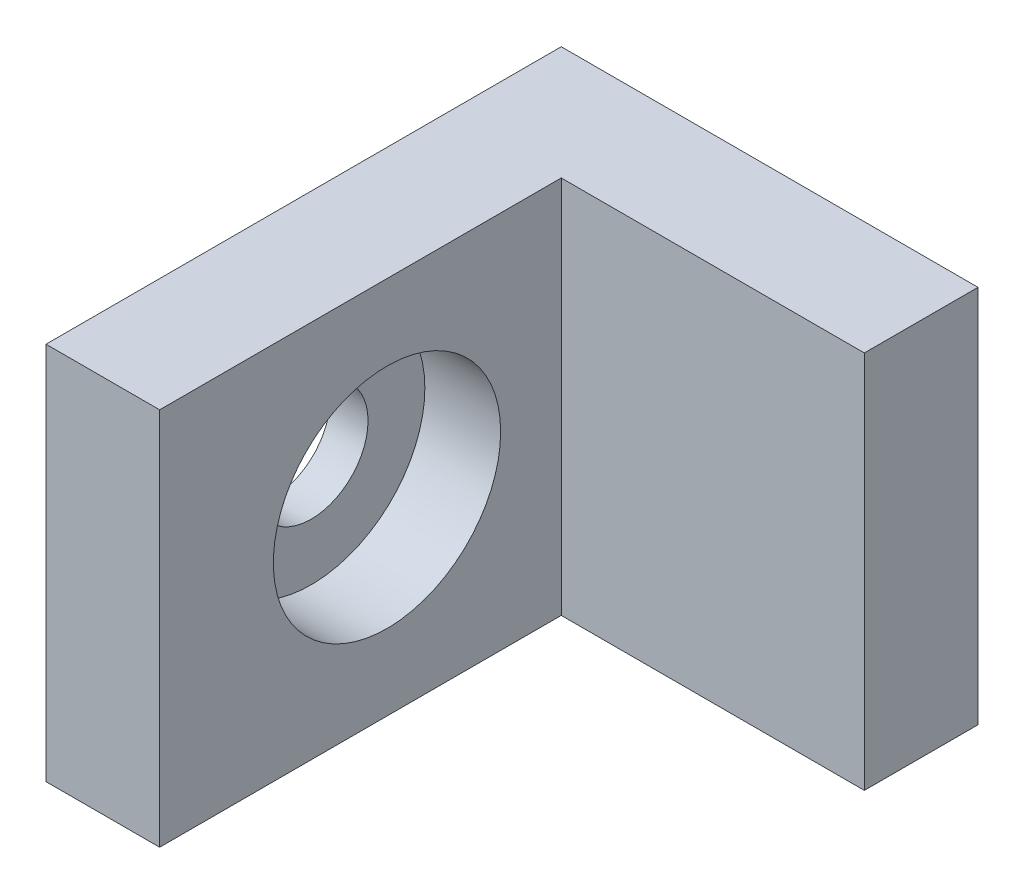
ISO-10303-21;
HEADER;
FILE_DESCRIPTION(('STEP AP214'),'2;1');
FILE_NAME('part.step','',(''),(''),'','','');
FILE_SCHEMA(('AUTOMOTIVE_DESIGN { 1 0 10303 214 1 1 1 1 }'));
ENDSEC;
DATA;
#1=APPLICATION_CONTEXT('core data for automotive mechanical design processes');
#2=APPLICATION_PROTOCOL_DEFINITION('international standard','automotive_design',2000,#1);
#3=PRODUCT_CONTEXT('',#1,'mechanical');
#4=PRODUCT('Part','Part','',(#3));
#5=PRODUCT_RELATED_PRODUCT_CATEGORY('part','',(#4));
#6=PRODUCT_DEFINITION_FORMATION('','',#4);
#7=PRODUCT_DEFINITION_CONTEXT('part definition',#1,'design');
#8=PRODUCT_DEFINITION('design','',#6,#7);
#9=PRODUCT_DEFINITION_SHAPE('','',#8);
#10=(LENGTH_UNIT() NAMED_UNIT(*) SI_UNIT(.MILLI.,.METRE.));
#11=(NAMED_UNIT(*) PLANE_ANGLE_UNIT() SI_UNIT($,.RADIAN.));
#12=(NAMED_UNIT(*) SI_UNIT($,.STERADIAN.) SOLID_ANGLE_UNIT());
#13=UNCERTAINTY_MEASURE_WITH_UNIT(LENGTH_MEASURE(1.E-05),#10,'distance_accuracy_value','');
#14=(GEOMETRIC_REPRESENTATION_CONTEXT(3) GLOBAL_UNCERTAINTY_ASSIGNED_CONTEXT((#13)) GLOBAL_UNIT_ASSIGNED_CONTEXT((#10,
#11,#12)) REPRESENTATION_CONTEXT('',''));
#15=CARTESIAN_POINT('',(0.,0.,0.));
#16=DIRECTION('',(0.,0.,1.));
#17=DIRECTION('',(1.,0.,0.));
#18=AXIS2_PLACEMENT_3D('',#15,#16,#17);
#19=CARTESIAN_POINT('',(3.,10.,0.));
#20=DIRECTION('',(0.,-1.,0.));
#21=DIRECTION('',(0.,0.,-1.));
#22=AXIS2_PLACEMENT_3D('',#19,#20,#21);
#23=PLANE('',#22);
#24=DIRECTION('',(1.,0.,0.));
#25=VECTOR('',#24,1.);
#26=CARTESIAN_POINT('',(0.,10.,2.4));
#27=LINE('',#26,#25);
#28=CARTESIAN_POINT('',(0.,10.,2.4));
#29=VERTEX_POINT('',#28);
#30=CARTESIAN_POINT('',(11.,10.,2.4));
#31=VERTEX_POINT('',#30);
#32=EDGE_CURVE('E50',#29,#31,#27,.T.);
#33=ORIENTED_EDGE('',*,*,#32,.F.);
#34=DIRECTION('',(0.,0.,1.));
#35=VECTOR('',#34,1.);
#36=CARTESIAN_POINT('',(0.,10.,0.));
#37=LINE('',#36,#35);
#38=CARTESIAN_POINT('',(0.,10.,16.));
#39=VERTEX_POINT('',#38);
#40=EDGE_CURVE('E83',#29,#39,#37,.T.);
#41=ORIENTED_EDGE('',*,*,#40,.T.);
#42=DIRECTION('',(-1.,0.,0.));
#43=VECTOR('',#42,1.);
#44=CARTESIAN_POINT('',(3.,10.,16.));
#45=LINE('',#44,#43);
#46=CARTESIAN_POINT('',(3.,10.,16.));
#47=VERTEX_POINT('',#46);
#48=EDGE_CURVE('E78',#47,#39,#45,.T.);
#49=ORIENTED_EDGE('',*,*,#48,.F.);
#50=DIRECTION('',(0.,0.,1.));
#51=VECTOR('',#50,1.);
#52=CARTESIAN_POINT('',(3.,10.,0.));
#53=LINE('',#52,#51);
#54=CARTESIAN_POINT('',(3.,10.,5.4));
#55=VERTEX_POINT('',#54);
#56=EDGE_CURVE('E96',#55,#47,#53,.T.);
#57=ORIENTED_EDGE('',*,*,#56,.F.);
#58=DIRECTION('',(-1.,0.,0.));
#59=VECTOR('',#58,1.);
#60=CARTESIAN_POINT('',(11.,10.,5.4));
#61=LINE('',#60,#59);
#62=CARTESIAN_POINT('',(11.,10.,5.4));
#63=VERTEX_POINT('',#62);
#64=EDGE_CURVE('E265',#63,#55,#61,.T.);
#65=ORIENTED_EDGE('',*,*,#64,.F.);
#66=DIRECTION('',(0.,0.,1.));
#67=VECTOR('',#66,1.);
#68=CARTESIAN_POINT('',(11.,10.,0.399999999999999));
#69=LINE('',#68,#67);
#70=EDGE_CURVE('E284',#31,#63,#69,.T.);
#71=ORIENTED_EDGE('',*,*,#70,.F.);
#72=EDGE_LOOP('',(#33,#41,#49,#57,#65,#71));
#73=FACE_BOUND('',#72,.T.);
#74=ADVANCED_FACE('F35',(#73),#23,.F.);
#75=CARTESIAN_POINT('',(3.,0.,0.));
#76=DIRECTION('',(0.,1.,0.));
#77=DIRECTION('',(0.,0.,1.));
#78=AXIS2_PLACEMENT_3D('',#75,#76,#77);
#79=PLANE('',#78);
#80=DIRECTION('',(-1.,0.,0.));
#81=VECTOR('',#80,1.);
#82=CARTESIAN_POINT('',(11.,0.,2.4));
#83=LINE('',#82,#81);
#84=CARTESIAN_POINT('',(11.,0.,2.4));
#85=VERTEX_POINT('',#84);
#86=CARTESIAN_POINT('',(0.,0.,2.4));
#87=VERTEX_POINT('',#86);
#88=EDGE_CURVE('E300',#85,#87,#83,.T.);
#89=ORIENTED_EDGE('',*,*,#88,.F.);
#90=DIRECTION('',(0.,0.,-1.));
#91=VECTOR('',#90,1.);
#92=CARTESIAN_POINT('',(11.,0.,0.399999999999999));
#93=LINE('',#92,#91);
#94=CARTESIAN_POINT('',(11.,0.,5.4));
#95=VERTEX_POINT('',#94);
#96=EDGE_CURVE('E282',#95,#85,#93,.T.);
#97=ORIENTED_EDGE('',*,*,#96,.F.);
#98=DIRECTION('',(1.,0.,0.));
#99=VECTOR('',#98,1.);
#100=CARTESIAN_POINT('',(3.,0.,5.4));
#101=LINE('',#100,#99);
#102=CARTESIAN_POINT('',(3.,0.,5.4));
#103=VERTEX_POINT('',#102);
#104=EDGE_CURVE('E277',#103,#95,#101,.T.);
#105=ORIENTED_EDGE('',*,*,#104,.F.);
#106=DIRECTION('',(0.,0.,-1.));
#107=VECTOR('',#106,1.);
#108=CARTESIAN_POINT('',(3.,0.,0.));
#109=LINE('',#108,#107);
#110=CARTESIAN_POINT('',(3.,0.,16.));
#111=VERTEX_POINT('',#110);
#112=EDGE_CURVE('E91',#111,#103,#109,.T.);
#113=ORIENTED_EDGE('',*,*,#112,.F.);
#114=DIRECTION('',(-1.,0.,0.));
#115=VECTOR('',#114,1.);
#116=CARTESIAN_POINT('',(3.,0.,16.));
#117=LINE('',#116,#115);
#118=CARTESIAN_POINT('',(0.,0.,16.));
#119=VERTEX_POINT('',#118);
#120=EDGE_CURVE('E75',#111,#119,#117,.T.);
#121=ORIENTED_EDGE('',*,*,#120,.T.);
#122=DIRECTION('',(0.,0.,-1.));
#123=VECTOR('',#122,1.);
#124=CARTESIAN_POINT('',(0.,0.,0.));
#125=LINE('',#124,#123);
#126=EDGE_CURVE('E82',#119,#87,#125,.T.);
#127=ORIENTED_EDGE('',*,*,#126,.T.);
#128=EDGE_LOOP('',(#89,#97,#105,#113,#121,#127));
#129=FACE_BOUND('',#128,.T.);
#130=ADVANCED_FACE('F88',(#129),#79,.F.);
#131=CARTESIAN_POINT('',(0.,0.,0.));
#132=DIRECTION('',(1.,0.,0.));
#133=DIRECTION('',(0.,0.,-1.));
#134=AXIS2_PLACEMENT_3D('',#131,#132,#133);
#135=PLANE('',#134);
#136=CARTESIAN_POINT('',(0.,5.,10.));
#137=DIRECTION('',(1.,0.,0.));
#138=DIRECTION('',(0.,0.,-1.));
#139=AXIS2_PLACEMENT_3D('',#136,#137,#138);
#140=CIRCLE('',#139,1.5);
#141=CARTESIAN_POINT('',(0.,5.,8.5));
#142=VERTEX_POINT('',#141);
#143=EDGE_CURVE('E105',#142,#142,#140,.T.);
#144=ORIENTED_EDGE('',*,*,#143,.T.);
#145=EDGE_LOOP('',(#144));
#146=FACE_BOUND('',#145,.T.);
#147=DIRECTION('',(0.,1.,0.));
#148=VECTOR('',#147,1.);
#149=CARTESIAN_POINT('',(0.,0.,2.4));
#150=LINE('',#149,#148);
#151=EDGE_CURVE('E95',#87,#29,#150,.T.);
#152=ORIENTED_EDGE('',*,*,#151,.F.);
#153=ORIENTED_EDGE('',*,*,#126,.F.);
#154=DIRECTION('',(0.,-1.,0.));
#155=VECTOR('',#154,1.);
#156=CARTESIAN_POINT('',(0.,0.,16.));
#157=LINE('',#156,#155);
#158=EDGE_CURVE('E72',#39,#119,#157,.T.);
#159=ORIENTED_EDGE('',*,*,#158,.F.);
#160=ORIENTED_EDGE('',*,*,#40,.F.);
#161=EDGE_LOOP('',(#152,#153,#159,#160));
#162=FACE_BOUND('',#161,.T.);
#163=ADVANCED_FACE('F94',(#146,#162),#135,.F.);
#164=CARTESIAN_POINT('',(11.,0.,0.));
#165=DIRECTION('',(-1.,0.,0.));
#166=DIRECTION('',(0.,0.,1.));
#167=AXIS2_PLACEMENT_3D('',#164,#165,#166);
#168=PLANE('',#167);
#169=DIRECTION('',(0.,-1.,0.));
#170=VECTOR('',#169,1.);
#171=CARTESIAN_POINT('',(11.,10.,2.4));
#172=LINE('',#171,#170);
#173=EDGE_CURVE('E303',#31,#85,#172,.T.);
#174=ORIENTED_EDGE('',*,*,#173,.F.);
#175=ORIENTED_EDGE('',*,*,#70,.T.);
#176=DIRECTION('',(0.,1.,0.));
#177=VECTOR('',#176,1.);
#178=CARTESIAN_POINT('',(11.,0.,5.4));
#179=LINE('',#178,#177);
#180=EDGE_CURVE('E110',#95,#63,#179,.T.);
#181=ORIENTED_EDGE('',*,*,#180,.F.);
#182=ORIENTED_EDGE('',*,*,#96,.T.);
#183=EDGE_LOOP('',(#174,#175,#181,#182));
#184=FACE_BOUND('',#183,.T.);
#185=ADVANCED_FACE('F140',(#184),#168,.F.);
#186=CARTESIAN_POINT('',(0.,5.,10.));
#187=DIRECTION('',(1.,0.,0.));
#188=DIRECTION('',(0.,0.,-1.));
#189=AXIS2_PLACEMENT_3D('',#186,#187,#188);
#190=CYLINDRICAL_SURFACE('',#189,1.5);
#191=ORIENTED_EDGE('',*,*,#143,.F.);
#192=EDGE_LOOP('',(#191));
#193=FACE_BOUND('',#192,.T.);
#194=CARTESIAN_POINT('',(1.,5.,10.));
#195=DIRECTION('',(1.,0.,0.));
#196=DIRECTION('',(0.,0.,-1.));
#197=AXIS2_PLACEMENT_3D('',#194,#195,#196);
#198=CIRCLE('',#197,1.5);
#199=CARTESIAN_POINT('',(1.,5.,8.5));
#200=VERTEX_POINT('',#199);
#201=EDGE_CURVE('E102',#200,#200,#198,.F.);
#202=ORIENTED_EDGE('',*,*,#201,.F.);
#203=EDGE_LOOP('',(#202));
#204=FACE_BOUND('',#203,.T.);
#205=ADVANCED_FACE('F136',(#193,#204),#190,.F.);
#206=CARTESIAN_POINT('',(3.,0.,16.));
#207=DIRECTION('',(0.,0.,-1.));
#208=DIRECTION('',(-1.,0.,0.));
#209=AXIS2_PLACEMENT_3D('',#206,#207,#208);
#210=PLANE('',#209);
#211=ORIENTED_EDGE('',*,*,#158,.T.);
#212=ORIENTED_EDGE('',*,*,#120,.F.);
#213=DIRECTION('',(0.,-1.,0.));
#214=VECTOR('',#213,1.);
#215=CARTESIAN_POINT('',(3.,0.,16.));
#216=LINE('',#215,#214);
#217=EDGE_CURVE('E59',#47,#111,#216,.T.);
#218=ORIENTED_EDGE('',*,*,#217,.F.);
#219=ORIENTED_EDGE('',*,*,#48,.T.);
#220=EDGE_LOOP('',(#211,#212,#218,#219));
#221=FACE_BOUND('',#220,.T.);
#222=ADVANCED_FACE('F74',(#221),#210,.F.);
#223=CARTESIAN_POINT('',(3.,0.,0.));
#224=DIRECTION('',(1.,0.,0.));
#225=DIRECTION('',(0.,0.,-1.));
#226=AXIS2_PLACEMENT_3D('',#223,#224,#225);
#227=PLANE('',#226);
#228=DIRECTION('',(0.,-1.,0.));
#229=VECTOR('',#228,1.);
#230=CARTESIAN_POINT('',(3.,10.,5.4));
#231=LINE('',#230,#229);
#232=EDGE_CURVE('E269',#55,#103,#231,.T.);
#233=ORIENTED_EDGE('',*,*,#232,.F.);
#234=ORIENTED_EDGE('',*,*,#56,.T.);
#235=ORIENTED_EDGE('',*,*,#217,.T.);
#236=ORIENTED_EDGE('',*,*,#112,.T.);
#237=EDGE_LOOP('',(#233,#234,#235,#236));
#238=FACE_BOUND('',#237,.T.);
#239=CARTESIAN_POINT('',(3.,5.,10.));
#240=DIRECTION('',(1.,0.,0.));
#241=DIRECTION('',(0.,0.,-1.));
#242=AXIS2_PLACEMENT_3D('',#239,#240,#241);
#243=CIRCLE('',#242,3.);
#244=CARTESIAN_POINT('',(3.,5.,7.));
#245=VERTEX_POINT('',#244);
#246=EDGE_CURVE('E109',#245,#245,#243,.T.);
#247=ORIENTED_EDGE('',*,*,#246,.F.);
#248=EDGE_LOOP('',(#247));
#249=FACE_BOUND('',#248,.T.);
#250=ADVANCED_FACE('F135',(#238,#249),#227,.T.);
#251=CARTESIAN_POINT('',(1.,5.,10.));
#252=DIRECTION('',(1.,0.,0.));
#253=DIRECTION('',(0.,0.,-1.));
#254=AXIS2_PLACEMENT_3D('',#251,#252,#253);
#255=PLANE('',#254);
#256=CARTESIAN_POINT('',(1.,5.,10.));
#257=DIRECTION('',(1.,0.,0.));
#258=DIRECTION('',(0.,0.,-1.));
#259=AXIS2_PLACEMENT_3D('',#256,#257,#258);
#260=CIRCLE('',#259,3.);
#261=CARTESIAN_POINT('',(1.,5.,7.));
#262=VERTEX_POINT('',#261);
#263=EDGE_CURVE('E106',#262,#262,#260,.T.);
#264=ORIENTED_EDGE('',*,*,#263,.T.);
#265=EDGE_LOOP('',(#264));
#266=FACE_BOUND('',#265,.T.);
#267=ORIENTED_EDGE('',*,*,#201,.T.);
#268=EDGE_LOOP('',(#267));
#269=FACE_BOUND('',#268,.T.);
#270=ADVANCED_FACE('F144',(#266,#269),#255,.T.);
#271=CARTESIAN_POINT('',(1.,5.,10.));
#272=DIRECTION('',(1.,0.,0.));
#273=DIRECTION('',(0.,0.,-1.));
#274=AXIS2_PLACEMENT_3D('',#271,#272,#273);
#275=CYLINDRICAL_SURFACE('',#274,3.);
#276=ORIENTED_EDGE('',*,*,#263,.F.);
#277=EDGE_LOOP('',(#276));
#278=FACE_BOUND('',#277,.T.);
#279=ORIENTED_EDGE('',*,*,#246,.T.);
#280=EDGE_LOOP('',(#279));
#281=FACE_BOUND('',#280,.T.);
#282=ADVANCED_FACE('F151',(#278,#281),#275,.F.);
#283=CARTESIAN_POINT('',(0.,0.,5.4));
#284=DIRECTION('',(0.,0.,1.));
#285=DIRECTION('',(1.,0.,0.));
#286=AXIS2_PLACEMENT_3D('',#283,#284,#285);
#287=PLANE('',#286);
#288=ORIENTED_EDGE('',*,*,#64,.T.);
#289=ORIENTED_EDGE('',*,*,#232,.T.);
#290=ORIENTED_EDGE('',*,*,#104,.T.);
#291=ORIENTED_EDGE('',*,*,#180,.T.);
#292=EDGE_LOOP('',(#288,#289,#290,#291));
#293=FACE_BOUND('',#292,.T.);
#294=ADVANCED_FACE('F154',(#293),#287,.T.);
#295=CARTESIAN_POINT('',(0.,0.,2.4));
#296=DIRECTION('',(0.,0.,-1.));
#297=DIRECTION('',(0.,1.,0.));
#298=AXIS2_PLACEMENT_3D('',#295,#296,#297);
#299=PLANE('',#298);
#300=CARTESIAN_POINT('',(7.8,5.,2.4));
#301=DIRECTION('',(0.,0.,-1.));
#302=DIRECTION('',(0.,1.,0.));
#303=AXIS2_PLACEMENT_3D('',#300,#301,#302);
#304=CIRCLE('',#303,2.5);
#305=CARTESIAN_POINT('',(7.8,7.5,2.4));
#306=VERTEX_POINT('',#305);
#307=EDGE_CURVE('E43',#306,#306,#304,.F.);
#308=ORIENTED_EDGE('',*,*,#307,.T.);
#309=EDGE_LOOP('',(#308));
#310=FACE_BOUND('',#309,.T.);
#311=ORIENTED_EDGE('',*,*,#173,.T.);
#312=ORIENTED_EDGE('',*,*,#88,.T.);
#313=ORIENTED_EDGE('',*,*,#151,.T.);
#314=ORIENTED_EDGE('',*,*,#32,.T.);
#315=EDGE_LOOP('',(#311,#312,#313,#314));
#316=FACE_BOUND('',#315,.T.);
#317=ADVANCED_FACE('F114',(#310,#316),#299,.T.);
#318=CARTESIAN_POINT('',(0.,0.,3.4));
#319=DIRECTION('',(0.,0.,1.));
#320=DIRECTION('',(1.,0.,0.));
#321=AXIS2_PLACEMENT_3D('',#318,#319,#320);
#322=PLANE('',#321);
#323=CARTESIAN_POINT('',(7.8,5.,3.4));
#324=DIRECTION('',(0.,0.,-1.));
#325=DIRECTION('',(0.,1.,0.));
#326=AXIS2_PLACEMENT_3D('',#323,#324,#325);
#327=CIRCLE('',#326,2.1);
#328=CARTESIAN_POINT('',(7.8,7.1,3.4));
#329=VERTEX_POINT('',#328);
#330=EDGE_CURVE('E107',#329,#329,#327,.T.);
#331=ORIENTED_EDGE('',*,*,#330,.T.);
#332=EDGE_LOOP('',(#331));
#333=FACE_BOUND('',#332,.T.);
#334=ADVANCED_FACE('F123',(#333),#322,.F.);
#335=CARTESIAN_POINT('',(7.8,5.,4.6));
#336=DIRECTION('',(0.,0.,-1.));
#337=DIRECTION('',(0.,1.,0.));
#338=AXIS2_PLACEMENT_3D('',#335,#336,#337);
#339=CYLINDRICAL_SURFACE('',#338,2.1);
#340=CARTESIAN_POINT('',(7.8,5.,2.8));
#341=DIRECTION('',(0.,0.,-1.));
#342=DIRECTION('',(0.,1.,0.));
#343=AXIS2_PLACEMENT_3D('',#340,#341,#342);
#344=CIRCLE('',#343,2.1);
#345=CARTESIAN_POINT('',(7.8,7.1,2.8));
#346=VERTEX_POINT('',#345);
#347=EDGE_CURVE('E11',#346,#346,#344,.T.);
#348=ORIENTED_EDGE('',*,*,#347,.T.);
#349=EDGE_LOOP('',(#348));
#350=FACE_BOUND('',#349,.T.);
#351=ORIENTED_EDGE('',*,*,#330,.F.);
#352=EDGE_LOOP('',(#351));
#353=FACE_BOUND('',#352,.T.);
#354=ADVANCED_FACE('F117',(#350,#353),#339,.F.);
#355=CARTESIAN_POINT('',(7.8,5.,2.8));
#356=DIRECTION('',(0.,0.,-1.));
#357=DIRECTION('',(0.,1.,0.));
#358=AXIS2_PLACEMENT_3D('',#355,#356,#357);
#359=TOROIDAL_SURFACE('',#358,2.5,0.4);
#360=ORIENTED_EDGE('',*,*,#347,.F.);
#361=EDGE_LOOP('',(#360));
#362=FACE_BOUND('',#361,.T.);
#363=ORIENTED_EDGE('',*,*,#307,.F.);
#364=EDGE_LOOP('',(#363));
#365=FACE_BOUND('',#364,.T.);
#366=ADVANCED_FACE('F37',(#362,#365),#359,.T.);
#367=CLOSED_SHELL('',(#74,#130,#163,#185,#205,#222,#250,#270,#282,#294,#317,#334,#354,#366));
#368=MANIFOLD_SOLID_BREP('B2',#367);
#369=ADVANCED_BREP_SHAPE_REPRESENTATION('',(#18,#368),#14);
#370=SHAPE_DEFINITION_REPRESENTATION(#9,#369);
ENDSEC;
END-ISO-10303-21;
